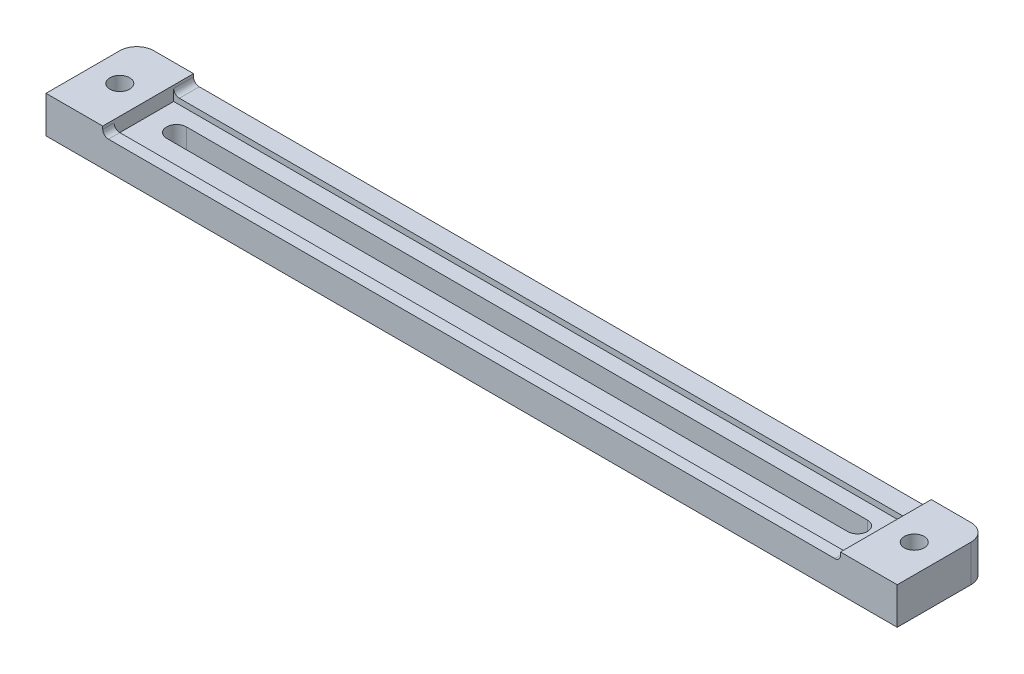
ISO-10303-21;
HEADER;
FILE_DESCRIPTION(('STEP AP214'),'2;1');
FILE_NAME('part.step','',(''),(''),'','','');
FILE_SCHEMA(('AUTOMOTIVE_DESIGN { 1 0 10303 214 1 1 1 1 }'));
ENDSEC;
DATA;
#1=APPLICATION_CONTEXT('core data for automotive mechanical design processes');
#2=APPLICATION_PROTOCOL_DEFINITION('international standard','automotive_design',2000,#1);
#3=PRODUCT_CONTEXT('',#1,'mechanical');
#4=PRODUCT('Part','Part','',(#3));
#5=PRODUCT_RELATED_PRODUCT_CATEGORY('part','',(#4));
#6=PRODUCT_DEFINITION_FORMATION('','',#4);
#7=PRODUCT_DEFINITION_CONTEXT('part definition',#1,'design');
#8=PRODUCT_DEFINITION('design','',#6,#7);
#9=PRODUCT_DEFINITION_SHAPE('','',#8);
#10=(LENGTH_UNIT() NAMED_UNIT(*) SI_UNIT(.MILLI.,.METRE.));
#11=(NAMED_UNIT(*) PLANE_ANGLE_UNIT() SI_UNIT($,.RADIAN.));
#12=(NAMED_UNIT(*) SI_UNIT($,.STERADIAN.) SOLID_ANGLE_UNIT());
#13=UNCERTAINTY_MEASURE_WITH_UNIT(LENGTH_MEASURE(1.E-05),#10,'distance_accuracy_value','');
#14=(GEOMETRIC_REPRESENTATION_CONTEXT(3) GLOBAL_UNCERTAINTY_ASSIGNED_CONTEXT((#13)) GLOBAL_UNIT_ASSIGNED_CONTEXT((#10,
#11,#12)) REPRESENTATION_CONTEXT('',''));
#15=CARTESIAN_POINT('',(0.,0.,0.));
#16=DIRECTION('',(0.,0.,1.));
#17=DIRECTION('',(1.,0.,0.));
#18=AXIS2_PLACEMENT_3D('',#15,#16,#17);
#19=CARTESIAN_POINT('',(0.,5.,0.));
#20=DIRECTION('',(0.,1.,0.));
#21=DIRECTION('',(0.,0.,1.));
#22=AXIS2_PLACEMENT_3D('',#19,#20,#21);
#23=PLANE('',#22);
#24=DIRECTION('',(1.,0.,0.));
#25=VECTOR('',#24,1.);
#26=CARTESIAN_POINT('',(0.,5.,-4.50000000000002));
#27=LINE('',#26,#25);
#28=CARTESIAN_POINT('',(-64.,5.,-4.50000000000002));
#29=VERTEX_POINT('',#28);
#30=CARTESIAN_POINT('',(64.,5.,-4.50000000000002));
#31=VERTEX_POINT('',#30);
#32=EDGE_CURVE('E251',#29,#31,#27,.T.);
#33=ORIENTED_EDGE('',*,*,#32,.T.);
#34=DIRECTION('',(0.,0.,1.));
#35=VECTOR('',#34,1.);
#36=CARTESIAN_POINT('',(64.,5.,-8.00000000000001));
#37=LINE('',#36,#35);
#38=CARTESIAN_POINT('',(64.,5.,-8.00000000000001));
#39=VERTEX_POINT('',#38);
#40=EDGE_CURVE('E345',#31,#39,#37,.F.);
#41=ORIENTED_EDGE('',*,*,#40,.T.);
#42=DIRECTION('',(-1.,0.,0.));
#43=VECTOR('',#42,1.);
#44=CARTESIAN_POINT('',(0.,5.,-8.00000000000001));
#45=LINE('',#44,#43);
#46=CARTESIAN_POINT('',(-64.,5.,-8.));
#47=VERTEX_POINT('',#46);
#48=EDGE_CURVE('E244',#39,#47,#45,.T.);
#49=ORIENTED_EDGE('',*,*,#48,.T.);
#50=DIRECTION('',(0.,0.,1.));
#51=VECTOR('',#50,1.);
#52=CARTESIAN_POINT('',(-64.,5.,0.));
#53=LINE('',#52,#51);
#54=EDGE_CURVE('E342',#47,#29,#53,.T.);
#55=ORIENTED_EDGE('',*,*,#54,.T.);
#56=EDGE_LOOP('',(#33,#41,#49,#55));
#57=FACE_BOUND('',#56,.T.);
#58=ADVANCED_FACE('F35',(#57),#23,.T.);
#59=DIRECTION('',(1.,0.,0.));
#60=VECTOR('',#59,1.);
#61=CARTESIAN_POINT('',(0.,5.,7.99999999999999));
#62=LINE('',#61,#60);
#63=CARTESIAN_POINT('',(-64.0000000000001,5.,8.));
#64=VERTEX_POINT('',#63);
#65=CARTESIAN_POINT('',(64.,5.,7.99999999999998));
#66=VERTEX_POINT('',#65);
#67=EDGE_CURVE('E247',#64,#66,#62,.T.);
#68=ORIENTED_EDGE('',*,*,#67,.T.);
#69=DIRECTION('',(0.,0.,1.));
#70=VECTOR('',#69,1.);
#71=CARTESIAN_POINT('',(64.,5.,5.99999999999998));
#72=LINE('',#71,#70);
#73=CARTESIAN_POINT('',(64.,5.,5.99999999999998));
#74=VERTEX_POINT('',#73);
#75=EDGE_CURVE('E349',#66,#74,#72,.F.);
#76=ORIENTED_EDGE('',*,*,#75,.T.);
#77=DIRECTION('',(1.,0.,0.));
#78=VECTOR('',#77,1.);
#79=CARTESIAN_POINT('',(0.,5.,5.99999999999998));
#80=LINE('',#79,#78);
#81=CARTESIAN_POINT('',(-64.0000000000001,5.,5.99999999999998));
#82=VERTEX_POINT('',#81);
#83=EDGE_CURVE('E254',#82,#74,#80,.T.);
#84=ORIENTED_EDGE('',*,*,#83,.F.);
#85=DIRECTION('',(0.,0.,-1.));
#86=VECTOR('',#85,1.);
#87=CARTESIAN_POINT('',(-64.,5.,0.));
#88=LINE('',#87,#86);
#89=EDGE_CURVE('E347',#82,#64,#88,.F.);
#90=ORIENTED_EDGE('',*,*,#89,.T.);
#91=EDGE_LOOP('',(#68,#76,#84,#90));
#92=FACE_BOUND('',#91,.T.);
#93=ADVANCED_FACE('F374',(#92),#23,.T.);
#94=CARTESIAN_POINT('',(0.,4.,-8.00000000000001));
#95=DIRECTION('',(0.,0.,1.));
#96=DIRECTION('',(1.,0.,0.));
#97=AXIS2_PLACEMENT_3D('',#94,#95,#96);
#98=PLANE('',#97);
#99=DIRECTION('',(-1.,0.,0.));
#100=VECTOR('',#99,1.);
#101=CARTESIAN_POINT('',(0.,0.,-8.00000000000001));
#102=LINE('',#101,#100);
#103=CARTESIAN_POINT('',(72.,0.,-8.00000000000002));
#104=VERTEX_POINT('',#103);
#105=CARTESIAN_POINT('',(-72.,0.,-7.99999999999999));
#106=VERTEX_POINT('',#105);
#107=EDGE_CURVE('E301',#104,#106,#102,.T.);
#108=ORIENTED_EDGE('',*,*,#107,.T.);
#109=DIRECTION('',(0.,-1.,0.));
#110=VECTOR('',#109,1.);
#111=CARTESIAN_POINT('',(-72.,4.,-7.99999999999999));
#112=LINE('',#111,#110);
#113=CARTESIAN_POINT('',(-72.,6.5,-8.));
#114=VERTEX_POINT('',#113);
#115=EDGE_CURVE('E211',#114,#106,#112,.T.);
#116=ORIENTED_EDGE('',*,*,#115,.F.);
#117=DIRECTION('',(-1.,0.,0.));
#118=VECTOR('',#117,1.);
#119=CARTESIAN_POINT('',(-65.0000000000001,6.5,-8.));
#120=LINE('',#119,#118);
#121=CARTESIAN_POINT('',(-65.0000000000001,6.5,-8.));
#122=VERTEX_POINT('',#121);
#123=EDGE_CURVE('E189',#122,#114,#120,.T.);
#124=ORIENTED_EDGE('',*,*,#123,.F.);
#125=DIRECTION('',(0.,-1.,0.));
#126=VECTOR('',#125,1.);
#127=CARTESIAN_POINT('',(-65.0000000000001,6.5,-8.));
#128=LINE('',#127,#126);
#129=CARTESIAN_POINT('',(-65.0000000000001,6.,-8.));
#130=VERTEX_POINT('',#129);
#131=EDGE_CURVE('E199',#122,#130,#128,.T.);
#132=ORIENTED_EDGE('',*,*,#131,.T.);
#133=CARTESIAN_POINT('',(-64.,6.,-8.));
#134=DIRECTION('',(0.,0.,1.));
#135=DIRECTION('',(1.,0.,0.));
#136=AXIS2_PLACEMENT_3D('',#133,#134,#135);
#137=CIRCLE('',#136,1.);
#138=EDGE_CURVE('E366',#130,#47,#137,.T.);
#139=ORIENTED_EDGE('',*,*,#138,.T.);
#140=ORIENTED_EDGE('',*,*,#48,.F.);
#141=CARTESIAN_POINT('',(64.,6.,-8.00000000000001));
#142=DIRECTION('',(0.,0.,1.));
#143=DIRECTION('',(1.,0.,0.));
#144=AXIS2_PLACEMENT_3D('',#141,#142,#143);
#145=CIRCLE('',#144,1.);
#146=CARTESIAN_POINT('',(65.,6.,-8.00000000000002));
#147=VERTEX_POINT('',#146);
#148=EDGE_CURVE('E357',#39,#147,#145,.T.);
#149=ORIENTED_EDGE('',*,*,#148,.T.);
#150=DIRECTION('',(0.,-1.,0.));
#151=VECTOR('',#150,1.);
#152=CARTESIAN_POINT('',(65.,6.5,-8.00000000000002));
#153=LINE('',#152,#151);
#154=CARTESIAN_POINT('',(65.,6.5,-8.00000000000002));
#155=VERTEX_POINT('',#154);
#156=EDGE_CURVE('E237',#155,#147,#153,.T.);
#157=ORIENTED_EDGE('',*,*,#156,.F.);
#158=DIRECTION('',(-1.,0.,0.));
#159=VECTOR('',#158,1.);
#160=CARTESIAN_POINT('',(72.,6.5,-8.00000000000002));
#161=LINE('',#160,#159);
#162=CARTESIAN_POINT('',(72.,6.5,-8.00000000000002));
#163=VERTEX_POINT('',#162);
#164=EDGE_CURVE('E234',#163,#155,#161,.T.);
#165=ORIENTED_EDGE('',*,*,#164,.F.);
#166=DIRECTION('',(0.,-1.,0.));
#167=VECTOR('',#166,1.);
#168=CARTESIAN_POINT('',(72.,4.,-8.00000000000002));
#169=LINE('',#168,#167);
#170=EDGE_CURVE('E317',#163,#104,#169,.T.);
#171=ORIENTED_EDGE('',*,*,#170,.T.);
#172=EDGE_LOOP('',(#108,#116,#124,#132,#139,#140,#149,#157,#165,#171));
#173=FACE_BOUND('',#172,.T.);
#174=ADVANCED_FACE('F209',(#173),#98,.F.);
#175=CARTESIAN_POINT('',(-72.,4.,-5.));
#176=DIRECTION('',(0.,-1.,0.));
#177=DIRECTION('',(0.,0.,-1.));
#178=AXIS2_PLACEMENT_3D('',#175,#176,#177);
#179=CYLINDRICAL_SURFACE('',#178,3.);
#180=CARTESIAN_POINT('',(-72.,0.,-5.));
#181=DIRECTION('',(0.,1.,0.));
#182=DIRECTION('',(0.,0.,1.));
#183=AXIS2_PLACEMENT_3D('',#180,#181,#182);
#184=CIRCLE('',#183,3.);
#185=CARTESIAN_POINT('',(-75.,0.,-4.99999999999997));
#186=VERTEX_POINT('',#185);
#187=EDGE_CURVE('E303',#106,#186,#184,.T.);
#188=ORIENTED_EDGE('',*,*,#187,.T.);
#189=DIRECTION('',(0.,-1.,0.));
#190=VECTOR('',#189,1.);
#191=CARTESIAN_POINT('',(-75.,4.,-4.99999999999997));
#192=LINE('',#191,#190);
#193=CARTESIAN_POINT('',(-75.,6.5,-4.99999999999997));
#194=VERTEX_POINT('',#193);
#195=EDGE_CURVE('E326',#194,#186,#192,.T.);
#196=ORIENTED_EDGE('',*,*,#195,.F.);
#197=CARTESIAN_POINT('',(-72.,6.5,-4.99999999999999));
#198=DIRECTION('',(0.,1.,0.));
#199=DIRECTION('',(0.,0.,1.));
#200=AXIS2_PLACEMENT_3D('',#197,#198,#199);
#201=CIRCLE('',#200,3.00000000000001);
#202=EDGE_CURVE('E212',#114,#194,#201,.T.);
#203=ORIENTED_EDGE('',*,*,#202,.F.);
#204=ORIENTED_EDGE('',*,*,#115,.T.);
#205=EDGE_LOOP('',(#188,#196,#203,#204));
#206=FACE_BOUND('',#205,.T.);
#207=ADVANCED_FACE('F420',(#206),#179,.T.);
#208=CARTESIAN_POINT('',(-75.,4.,0.));
#209=DIRECTION('',(-1.,0.,0.));
#210=DIRECTION('',(0.,0.,1.));
#211=AXIS2_PLACEMENT_3D('',#208,#209,#210);
#212=PLANE('',#211);
#213=DIRECTION('',(0.,0.,-1.));
#214=VECTOR('',#213,1.);
#215=CARTESIAN_POINT('',(-75.,0.,0.));
#216=LINE('',#215,#214);
#217=CARTESIAN_POINT('',(-75.,0.,8.00000000000001));
#218=VERTEX_POINT('',#217);
#219=EDGE_CURVE('E306',#218,#186,#216,.T.);
#220=ORIENTED_EDGE('',*,*,#219,.F.);
#221=DIRECTION('',(0.,-1.,0.));
#222=VECTOR('',#221,1.);
#223=CARTESIAN_POINT('',(-75.,4.,8.00000000000001));
#224=LINE('',#223,#222);
#225=CARTESIAN_POINT('',(-75.,6.5,8.00000000000001));
#226=VERTEX_POINT('',#225);
#227=EDGE_CURVE('E324',#226,#218,#224,.T.);
#228=ORIENTED_EDGE('',*,*,#227,.F.);
#229=DIRECTION('',(0.,0.,1.));
#230=VECTOR('',#229,1.);
#231=CARTESIAN_POINT('',(-75.,6.5,-4.99999999999997));
#232=LINE('',#231,#230);
#233=EDGE_CURVE('E214',#194,#226,#232,.T.);
#234=ORIENTED_EDGE('',*,*,#233,.F.);
#235=ORIENTED_EDGE('',*,*,#195,.T.);
#236=EDGE_LOOP('',(#220,#228,#234,#235));
#237=FACE_BOUND('',#236,.T.);
#238=ADVANCED_FACE('F423',(#237),#212,.T.);
#239=CARTESIAN_POINT('',(0.,4.,7.99999999999999));
#240=DIRECTION('',(0.,0.,1.));
#241=DIRECTION('',(1.,0.,0.));
#242=AXIS2_PLACEMENT_3D('',#239,#240,#241);
#243=PLANE('',#242);
#244=DIRECTION('',(-1.,0.,0.));
#245=VECTOR('',#244,1.);
#246=CARTESIAN_POINT('',(0.,0.,7.99999999999999));
#247=LINE('',#246,#245);
#248=CARTESIAN_POINT('',(75.,0.,7.99999999999998));
#249=VERTEX_POINT('',#248);
#250=EDGE_CURVE('E309',#249,#218,#247,.T.);
#251=ORIENTED_EDGE('',*,*,#250,.F.);
#252=DIRECTION('',(0.,-1.,0.));
#253=VECTOR('',#252,1.);
#254=CARTESIAN_POINT('',(75.,4.,7.99999999999998));
#255=LINE('',#254,#253);
#256=CARTESIAN_POINT('',(75.,6.5,7.99999999999998));
#257=VERTEX_POINT('',#256);
#258=EDGE_CURVE('E322',#257,#249,#255,.T.);
#259=ORIENTED_EDGE('',*,*,#258,.F.);
#260=DIRECTION('',(1.,0.,0.));
#261=VECTOR('',#260,1.);
#262=CARTESIAN_POINT('',(65.,6.5,7.99999999999998));
#263=LINE('',#262,#261);
#264=CARTESIAN_POINT('',(65.,6.5,7.99999999999998));
#265=VERTEX_POINT('',#264);
#266=EDGE_CURVE('E225',#265,#257,#263,.T.);
#267=ORIENTED_EDGE('',*,*,#266,.F.);
#268=DIRECTION('',(0.,-1.,0.));
#269=VECTOR('',#268,1.);
#270=CARTESIAN_POINT('',(65.,6.5,7.99999999999998));
#271=LINE('',#270,#269);
#272=CARTESIAN_POINT('',(65.,6.,7.99999999999998));
#273=VERTEX_POINT('',#272);
#274=EDGE_CURVE('E240',#265,#273,#271,.T.);
#275=ORIENTED_EDGE('',*,*,#274,.T.);
#276=CARTESIAN_POINT('',(64.,6.,7.99999999999998));
#277=DIRECTION('',(0.,0.,1.));
#278=DIRECTION('',(1.,0.,0.));
#279=AXIS2_PLACEMENT_3D('',#276,#277,#278);
#280=CIRCLE('',#279,1.);
#281=EDGE_CURVE('E359',#273,#66,#280,.F.);
#282=ORIENTED_EDGE('',*,*,#281,.T.);
#283=ORIENTED_EDGE('',*,*,#67,.F.);
#284=CARTESIAN_POINT('',(-64.0000000000001,6.,8.));
#285=DIRECTION('',(0.,0.,1.));
#286=DIRECTION('',(1.,0.,0.));
#287=AXIS2_PLACEMENT_3D('',#284,#285,#286);
#288=CIRCLE('',#287,1.);
#289=CARTESIAN_POINT('',(-65.,6.,8.));
#290=VERTEX_POINT('',#289);
#291=EDGE_CURVE('E11',#64,#290,#288,.F.);
#292=ORIENTED_EDGE('',*,*,#291,.T.);
#293=DIRECTION('',(0.,-1.,0.));
#294=VECTOR('',#293,1.);
#295=CARTESIAN_POINT('',(-65.,6.5,8.));
#296=LINE('',#295,#294);
#297=CARTESIAN_POINT('',(-65.,6.5,8.));
#298=VERTEX_POINT('',#297);
#299=EDGE_CURVE('E206',#298,#290,#296,.T.);
#300=ORIENTED_EDGE('',*,*,#299,.F.);
#301=DIRECTION('',(1.,0.,0.));
#302=VECTOR('',#301,1.);
#303=CARTESIAN_POINT('',(-75.,6.5,8.00000000000001));
#304=LINE('',#303,#302);
#305=EDGE_CURVE('E193',#226,#298,#304,.T.);
#306=ORIENTED_EDGE('',*,*,#305,.F.);
#307=ORIENTED_EDGE('',*,*,#227,.T.);
#308=EDGE_LOOP('',(#251,#259,#267,#275,#282,#283,#292,#300,#306,#307));
#309=FACE_BOUND('',#308,.T.);
#310=ADVANCED_FACE('F380',(#309),#243,.T.);
#311=CARTESIAN_POINT('',(75.,4.,0.));
#312=DIRECTION('',(-1.,0.,0.));
#313=DIRECTION('',(0.,0.,1.));
#314=AXIS2_PLACEMENT_3D('',#311,#312,#313);
#315=PLANE('',#314);
#316=DIRECTION('',(0.,0.,-1.));
#317=VECTOR('',#316,1.);
#318=CARTESIAN_POINT('',(75.,0.,0.));
#319=LINE('',#318,#317);
#320=CARTESIAN_POINT('',(75.,0.,-4.99999999999999));
#321=VERTEX_POINT('',#320);
#322=EDGE_CURVE('E312',#249,#321,#319,.T.);
#323=ORIENTED_EDGE('',*,*,#322,.T.);
#324=DIRECTION('',(0.,-1.,0.));
#325=VECTOR('',#324,1.);
#326=CARTESIAN_POINT('',(75.,4.,-4.99999999999999));
#327=LINE('',#326,#325);
#328=CARTESIAN_POINT('',(75.,6.5,-4.99999999999999));
#329=VERTEX_POINT('',#328);
#330=EDGE_CURVE('E319',#329,#321,#327,.T.);
#331=ORIENTED_EDGE('',*,*,#330,.F.);
#332=DIRECTION('',(0.,0.,-1.));
#333=VECTOR('',#332,1.);
#334=CARTESIAN_POINT('',(75.,6.5,7.99999999999998));
#335=LINE('',#334,#333);
#336=EDGE_CURVE('E228',#257,#329,#335,.T.);
#337=ORIENTED_EDGE('',*,*,#336,.F.);
#338=ORIENTED_EDGE('',*,*,#258,.T.);
#339=EDGE_LOOP('',(#323,#331,#337,#338));
#340=FACE_BOUND('',#339,.T.);
#341=ADVANCED_FACE('F426',(#340),#315,.F.);
#342=CARTESIAN_POINT('',(0.,4.,-1.75000000000001));
#343=DIRECTION('',(0.,0.,1.));
#344=DIRECTION('',(1.,0.,0.));
#345=AXIS2_PLACEMENT_3D('',#342,#343,#344);
#346=PLANE('',#345);
#347=DIRECTION('',(-1.,0.,0.));
#348=VECTOR('',#347,1.);
#349=CARTESIAN_POINT('',(0.,0.,-1.75000000000001));
#350=LINE('',#349,#348);
#351=CARTESIAN_POINT('',(60.,0.,-1.75000000000002));
#352=VERTEX_POINT('',#351);
#353=CARTESIAN_POINT('',(-60.,0.,-1.75));
#354=VERTEX_POINT('',#353);
#355=EDGE_CURVE('E272',#352,#354,#350,.T.);
#356=ORIENTED_EDGE('',*,*,#355,.F.);
#357=DIRECTION('',(0.,-1.,0.));
#358=VECTOR('',#357,1.);
#359=CARTESIAN_POINT('',(60.,4.,-1.75000000000002));
#360=LINE('',#359,#358);
#361=CARTESIAN_POINT('',(60.,4.,-1.75000000000002));
#362=VERTEX_POINT('',#361);
#363=EDGE_CURVE('E320',#362,#352,#360,.T.);
#364=ORIENTED_EDGE('',*,*,#363,.F.);
#365=DIRECTION('',(-1.,0.,0.));
#366=VECTOR('',#365,1.);
#367=CARTESIAN_POINT('',(0.,4.,-1.75000000000001));
#368=LINE('',#367,#366);
#369=CARTESIAN_POINT('',(-60.,4.,-1.75));
#370=VERTEX_POINT('',#369);
#371=EDGE_CURVE('E273',#362,#370,#368,.T.);
#372=ORIENTED_EDGE('',*,*,#371,.T.);
#373=DIRECTION('',(0.,-1.,0.));
#374=VECTOR('',#373,1.);
#375=CARTESIAN_POINT('',(-60.,4.,-1.75));
#376=LINE('',#375,#374);
#377=EDGE_CURVE('E284',#370,#354,#376,.T.);
#378=ORIENTED_EDGE('',*,*,#377,.T.);
#379=EDGE_LOOP('',(#356,#364,#372,#378));
#380=FACE_BOUND('',#379,.T.);
#381=ADVANCED_FACE('F428',(#380),#346,.T.);
#382=CARTESIAN_POINT('',(60.,4.,-2.11419423634673E-13));
#383=DIRECTION('',(0.,-1.,0.));
#384=DIRECTION('',(0.,0.,-1.));
#385=AXIS2_PLACEMENT_3D('',#382,#383,#384);
#386=CYLINDRICAL_SURFACE('',#385,1.75);
#387=CARTESIAN_POINT('',(60.,0.,-2.11419423634673E-13));
#388=DIRECTION('',(0.,1.,0.));
#389=DIRECTION('',(0.,0.,1.));
#390=AXIS2_PLACEMENT_3D('',#387,#388,#389);
#391=CIRCLE('',#390,1.75);
#392=CARTESIAN_POINT('',(60.,0.,1.74999999999998));
#393=VERTEX_POINT('',#392);
#394=EDGE_CURVE('E287',#352,#393,#391,.F.);
#395=ORIENTED_EDGE('',*,*,#394,.T.);
#396=DIRECTION('',(0.,-1.,0.));
#397=VECTOR('',#396,1.);
#398=CARTESIAN_POINT('',(60.,4.,1.74999999999998));
#399=LINE('',#398,#397);
#400=CARTESIAN_POINT('',(60.,4.,1.74999999999998));
#401=VERTEX_POINT('',#400);
#402=EDGE_CURVE('E333',#401,#393,#399,.T.);
#403=ORIENTED_EDGE('',*,*,#402,.F.);
#404=CARTESIAN_POINT('',(60.,4.,-2.11419423634673E-13));
#405=DIRECTION('',(0.,1.,0.));
#406=DIRECTION('',(0.,0.,1.));
#407=AXIS2_PLACEMENT_3D('',#404,#405,#406);
#408=CIRCLE('',#407,1.75);
#409=EDGE_CURVE('E276',#362,#401,#408,.F.);
#410=ORIENTED_EDGE('',*,*,#409,.F.);
#411=ORIENTED_EDGE('',*,*,#363,.T.);
#412=EDGE_LOOP('',(#395,#403,#410,#411));
#413=FACE_BOUND('',#412,.T.);
#414=ADVANCED_FACE('F434',(#413),#386,.F.);
#415=CARTESIAN_POINT('',(0.,4.,1.74999999999999));
#416=DIRECTION('',(0.,0.,1.));
#417=DIRECTION('',(1.,0.,0.));
#418=AXIS2_PLACEMENT_3D('',#415,#416,#417);
#419=PLANE('',#418);
#420=DIRECTION('',(-1.,0.,0.));
#421=VECTOR('',#420,1.);
#422=CARTESIAN_POINT('',(0.,0.,1.74999999999999));
#423=LINE('',#422,#421);
#424=CARTESIAN_POINT('',(-60.,0.,1.75));
#425=VERTEX_POINT('',#424);
#426=EDGE_CURVE('E289',#393,#425,#423,.T.);
#427=ORIENTED_EDGE('',*,*,#426,.T.);
#428=DIRECTION('',(0.,-1.,0.));
#429=VECTOR('',#428,1.);
#430=CARTESIAN_POINT('',(-60.,4.,1.75));
#431=LINE('',#430,#429);
#432=CARTESIAN_POINT('',(-60.,4.,1.75));
#433=VERTEX_POINT('',#432);
#434=EDGE_CURVE('E331',#433,#425,#431,.T.);
#435=ORIENTED_EDGE('',*,*,#434,.F.);
#436=DIRECTION('',(-1.,0.,0.));
#437=VECTOR('',#436,1.);
#438=CARTESIAN_POINT('',(0.,4.,1.74999999999999));
#439=LINE('',#438,#437);
#440=EDGE_CURVE('E279',#401,#433,#439,.T.);
#441=ORIENTED_EDGE('',*,*,#440,.F.);
#442=ORIENTED_EDGE('',*,*,#402,.T.);
#443=EDGE_LOOP('',(#427,#435,#441,#442));
#444=FACE_BOUND('',#443,.T.);
#445=ADVANCED_FACE('F476',(#444),#419,.F.);
#446=CARTESIAN_POINT('',(-70.,4.,0.));
#447=DIRECTION('',(0.,-1.,0.));
#448=DIRECTION('',(0.,0.,-1.));
#449=AXIS2_PLACEMENT_3D('',#446,#447,#448);
#450=CYLINDRICAL_SURFACE('',#449,1.75);
#451=CARTESIAN_POINT('',(-70.,0.,0.));
#452=DIRECTION('',(0.,1.,0.));
#453=DIRECTION('',(0.,0.,1.));
#454=AXIS2_PLACEMENT_3D('',#451,#452,#453);
#455=CIRCLE('',#454,1.75);
#456=CARTESIAN_POINT('',(-70.,0.,1.75));
#457=VERTEX_POINT('',#456);
#458=EDGE_CURVE('E298',#457,#457,#455,.T.);
#459=ORIENTED_EDGE('',*,*,#458,.F.);
#460=EDGE_LOOP('',(#459));
#461=FACE_BOUND('',#460,.T.);
#462=CARTESIAN_POINT('',(-70.,6.5,0.));
#463=DIRECTION('',(0.,1.,0.));
#464=DIRECTION('',(0.,0.,1.));
#465=AXIS2_PLACEMENT_3D('',#462,#463,#464);
#466=CIRCLE('',#465,1.75);
#467=CARTESIAN_POINT('',(-70.,6.5,1.75));
#468=VERTEX_POINT('',#467);
#469=EDGE_CURVE('E196',#468,#468,#466,.T.);
#470=ORIENTED_EDGE('',*,*,#469,.T.);
#471=EDGE_LOOP('',(#470));
#472=FACE_BOUND('',#471,.T.);
#473=ADVANCED_FACE('F470',(#461,#472),#450,.F.);
#474=CARTESIAN_POINT('',(70.,4.,-2.42861286636753E-13));
#475=DIRECTION('',(0.,-1.,0.));
#476=DIRECTION('',(0.,0.,-1.));
#477=AXIS2_PLACEMENT_3D('',#474,#475,#476);
#478=CYLINDRICAL_SURFACE('',#477,1.75);
#479=CARTESIAN_POINT('',(70.,0.,-2.42861286636753E-13));
#480=DIRECTION('',(0.,1.,0.));
#481=DIRECTION('',(0.,0.,1.));
#482=AXIS2_PLACEMENT_3D('',#479,#480,#481);
#483=CIRCLE('',#482,1.75);
#484=CARTESIAN_POINT('',(70.,0.,1.74999999999975));
#485=VERTEX_POINT('',#484);
#486=EDGE_CURVE('E295',#485,#485,#483,.F.);
#487=ORIENTED_EDGE('',*,*,#486,.T.);
#488=EDGE_LOOP('',(#487));
#489=FACE_BOUND('',#488,.T.);
#490=CARTESIAN_POINT('',(70.,6.5,-2.42861286636753E-13));
#491=DIRECTION('',(0.,1.,0.));
#492=DIRECTION('',(0.,0.,1.));
#493=AXIS2_PLACEMENT_3D('',#490,#491,#492);
#494=CIRCLE('',#493,1.75);
#495=CARTESIAN_POINT('',(70.,6.5,1.74999999999975));
#496=VERTEX_POINT('',#495);
#497=EDGE_CURVE('E205',#496,#496,#494,.T.);
#498=ORIENTED_EDGE('',*,*,#497,.T.);
#499=EDGE_LOOP('',(#498));
#500=FACE_BOUND('',#499,.T.);
#501=ADVANCED_FACE('F464',(#489,#500),#478,.F.);
#502=CARTESIAN_POINT('',(-60.,4.,0.));
#503=DIRECTION('',(0.,-1.,0.));
#504=DIRECTION('',(0.,0.,-1.));
#505=AXIS2_PLACEMENT_3D('',#502,#503,#504);
#506=CYLINDRICAL_SURFACE('',#505,1.75);
#507=CARTESIAN_POINT('',(-60.,0.,0.));
#508=DIRECTION('',(0.,1.,0.));
#509=DIRECTION('',(0.,0.,1.));
#510=AXIS2_PLACEMENT_3D('',#507,#508,#509);
#511=CIRCLE('',#510,1.75);
#512=EDGE_CURVE('E292',#354,#425,#511,.T.);
#513=ORIENTED_EDGE('',*,*,#512,.F.);
#514=ORIENTED_EDGE('',*,*,#377,.F.);
#515=CARTESIAN_POINT('',(-60.,4.,0.));
#516=DIRECTION('',(0.,1.,0.));
#517=DIRECTION('',(0.,0.,1.));
#518=AXIS2_PLACEMENT_3D('',#515,#516,#517);
#519=CIRCLE('',#518,1.75);
#520=EDGE_CURVE('E281',#370,#433,#519,.T.);
#521=ORIENTED_EDGE('',*,*,#520,.T.);
#522=ORIENTED_EDGE('',*,*,#434,.T.);
#523=EDGE_LOOP('',(#513,#514,#521,#522));
#524=FACE_BOUND('',#523,.T.);
#525=ADVANCED_FACE('F460',(#524),#506,.F.);
#526=CARTESIAN_POINT('',(72.,4.,-5.00000000000002));
#527=DIRECTION('',(0.,-1.,0.));
#528=DIRECTION('',(0.,0.,-1.));
#529=AXIS2_PLACEMENT_3D('',#526,#527,#528);
#530=CYLINDRICAL_SURFACE('',#529,3.);
#531=CARTESIAN_POINT('',(72.,0.,-5.00000000000002));
#532=DIRECTION('',(0.,1.,0.));
#533=DIRECTION('',(0.,0.,1.));
#534=AXIS2_PLACEMENT_3D('',#531,#532,#533);
#535=CIRCLE('',#534,3.);
#536=EDGE_CURVE('E277',#104,#321,#535,.F.);
#537=ORIENTED_EDGE('',*,*,#536,.F.);
#538=ORIENTED_EDGE('',*,*,#170,.F.);
#539=CARTESIAN_POINT('',(71.9999999999999,6.5,-4.99999999999999));
#540=DIRECTION('',(0.,1.,0.));
#541=DIRECTION('',(0.,0.,1.));
#542=AXIS2_PLACEMENT_3D('',#539,#540,#541);
#543=CIRCLE('',#542,3.00000000000003);
#544=EDGE_CURVE('E231',#329,#163,#543,.T.);
#545=ORIENTED_EDGE('',*,*,#544,.F.);
#546=ORIENTED_EDGE('',*,*,#330,.T.);
#547=EDGE_LOOP('',(#537,#538,#545,#546));
#548=FACE_BOUND('',#547,.T.);
#549=ADVANCED_FACE('F414',(#548),#530,.T.);
#550=CARTESIAN_POINT('',(0.,4.,0.));
#551=DIRECTION('',(0.,1.,0.));
#552=DIRECTION('',(0.,0.,1.));
#553=AXIS2_PLACEMENT_3D('',#550,#551,#552);
#554=PLANE('',#553);
#555=DIRECTION('',(1.,0.,0.));
#556=VECTOR('',#555,1.);
#557=CARTESIAN_POINT('',(0.,4.,-4.50000000000002));
#558=LINE('',#557,#556);
#559=CARTESIAN_POINT('',(-65.,4.,-4.50000000000002));
#560=VERTEX_POINT('',#559);
#561=CARTESIAN_POINT('',(65.,4.,-4.50000000000002));
#562=VERTEX_POINT('',#561);
#563=EDGE_CURVE('E243',#560,#562,#558,.T.);
#564=ORIENTED_EDGE('',*,*,#563,.F.);
#565=DIRECTION('',(0.,0.,-1.));
#566=VECTOR('',#565,1.);
#567=CARTESIAN_POINT('',(-65.,4.,0.));
#568=LINE('',#567,#566);
#569=CARTESIAN_POINT('',(-65.,4.,5.99999999999998));
#570=VERTEX_POINT('',#569);
#571=EDGE_CURVE('E248',#570,#560,#568,.T.);
#572=ORIENTED_EDGE('',*,*,#571,.F.);
#573=DIRECTION('',(1.,0.,0.));
#574=VECTOR('',#573,1.);
#575=CARTESIAN_POINT('',(0.,4.,5.99999999999998));
#576=LINE('',#575,#574);
#577=CARTESIAN_POINT('',(65.,4.,5.99999999999998));
#578=VERTEX_POINT('',#577);
#579=EDGE_CURVE('E261',#570,#578,#576,.T.);
#580=ORIENTED_EDGE('',*,*,#579,.T.);
#581=DIRECTION('',(0.,0.,-1.));
#582=VECTOR('',#581,1.);
#583=CARTESIAN_POINT('',(65.,4.,0.));
#584=LINE('',#583,#582);
#585=EDGE_CURVE('E258',#578,#562,#584,.T.);
#586=ORIENTED_EDGE('',*,*,#585,.T.);
#587=EDGE_LOOP('',(#564,#572,#580,#586));
#588=FACE_BOUND('',#587,.T.);
#589=ORIENTED_EDGE('',*,*,#371,.F.);
#590=ORIENTED_EDGE('',*,*,#409,.T.);
#591=ORIENTED_EDGE('',*,*,#440,.T.);
#592=ORIENTED_EDGE('',*,*,#520,.F.);
#593=EDGE_LOOP('',(#589,#590,#591,#592));
#594=FACE_BOUND('',#593,.T.);
#595=ADVANCED_FACE('F385',(#588,#594),#554,.T.);
#596=CARTESIAN_POINT('',(0.,0.,0.));
#597=DIRECTION('',(0.,1.,0.));
#598=DIRECTION('',(0.,0.,1.));
#599=AXIS2_PLACEMENT_3D('',#596,#597,#598);
#600=PLANE('',#599);
#601=ORIENTED_EDGE('',*,*,#355,.T.);
#602=ORIENTED_EDGE('',*,*,#512,.T.);
#603=ORIENTED_EDGE('',*,*,#426,.F.);
#604=ORIENTED_EDGE('',*,*,#394,.F.);
#605=EDGE_LOOP('',(#601,#602,#603,#604));
#606=FACE_BOUND('',#605,.T.);
#607=ORIENTED_EDGE('',*,*,#486,.F.);
#608=EDGE_LOOP('',(#607));
#609=FACE_BOUND('',#608,.T.);
#610=ORIENTED_EDGE('',*,*,#458,.T.);
#611=EDGE_LOOP('',(#610));
#612=FACE_BOUND('',#611,.T.);
#613=ORIENTED_EDGE('',*,*,#107,.F.);
#614=ORIENTED_EDGE('',*,*,#536,.T.);
#615=ORIENTED_EDGE('',*,*,#322,.F.);
#616=ORIENTED_EDGE('',*,*,#250,.T.);
#617=ORIENTED_EDGE('',*,*,#219,.T.);
#618=ORIENTED_EDGE('',*,*,#187,.F.);
#619=EDGE_LOOP('',(#613,#614,#615,#616,#617,#618));
#620=FACE_BOUND('',#619,.T.);
#621=ADVANCED_FACE('F417',(#606,#609,#612,#620),#600,.F.);
#622=CARTESIAN_POINT('',(0.,5.,-4.50000000000002));
#623=DIRECTION('',(0.,0.,-1.));
#624=DIRECTION('',(-1.,0.,0.));
#625=AXIS2_PLACEMENT_3D('',#622,#623,#624);
#626=PLANE('',#625);
#627=ORIENTED_EDGE('',*,*,#563,.T.);
#628=DIRECTION('',(0.,-1.,0.));
#629=VECTOR('',#628,1.);
#630=CARTESIAN_POINT('',(65.,5.,-4.50000000000002));
#631=LINE('',#630,#629);
#632=CARTESIAN_POINT('',(65.,6.,-4.50000000000002));
#633=VERTEX_POINT('',#632);
#634=EDGE_CURVE('E269',#633,#562,#631,.T.);
#635=ORIENTED_EDGE('',*,*,#634,.F.);
#636=CARTESIAN_POINT('',(64.,6.,-4.50000000000002));
#637=DIRECTION('',(0.,0.,-1.));
#638=DIRECTION('',(-1.,0.,0.));
#639=AXIS2_PLACEMENT_3D('',#636,#637,#638);
#640=CIRCLE('',#639,1.);
#641=EDGE_CURVE('E355',#633,#31,#640,.T.);
#642=ORIENTED_EDGE('',*,*,#641,.T.);
#643=ORIENTED_EDGE('',*,*,#32,.F.);
#644=CARTESIAN_POINT('',(-64.,6.,-4.50000000000002));
#645=DIRECTION('',(0.,0.,-1.));
#646=DIRECTION('',(-1.,0.,0.));
#647=AXIS2_PLACEMENT_3D('',#644,#645,#646);
#648=CIRCLE('',#647,1.);
#649=CARTESIAN_POINT('',(-65.,6.,-4.50000000000002));
#650=VERTEX_POINT('',#649);
#651=EDGE_CURVE('E364',#29,#650,#648,.T.);
#652=ORIENTED_EDGE('',*,*,#651,.T.);
#653=DIRECTION('',(0.,-1.,0.));
#654=VECTOR('',#653,1.);
#655=CARTESIAN_POINT('',(-65.,5.,-4.50000000000002));
#656=LINE('',#655,#654);
#657=EDGE_CURVE('E50',#650,#560,#656,.T.);
#658=ORIENTED_EDGE('',*,*,#657,.T.);
#659=EDGE_LOOP('',(#627,#635,#642,#643,#652,#658));
#660=FACE_BOUND('',#659,.T.);
#661=ADVANCED_FACE('F388',(#660),#626,.F.);
#662=CARTESIAN_POINT('',(65.,5.,0.));
#663=DIRECTION('',(-1.,0.,0.));
#664=DIRECTION('',(0.,0.,1.));
#665=AXIS2_PLACEMENT_3D('',#662,#663,#664);
#666=PLANE('',#665);
#667=ORIENTED_EDGE('',*,*,#156,.T.);
#668=DIRECTION('',(0.,0.,1.));
#669=VECTOR('',#668,1.);
#670=CARTESIAN_POINT('',(65.,6.,-4.50000000000002));
#671=LINE('',#670,#669);
#672=EDGE_CURVE('E339',#147,#633,#671,.T.);
#673=ORIENTED_EDGE('',*,*,#672,.T.);
#674=ORIENTED_EDGE('',*,*,#634,.T.);
#675=ORIENTED_EDGE('',*,*,#585,.F.);
#676=DIRECTION('',(0.,-1.,0.));
#677=VECTOR('',#676,1.);
#678=CARTESIAN_POINT('',(65.,5.,5.99999999999998));
#679=LINE('',#678,#677);
#680=CARTESIAN_POINT('',(65.,6.,5.99999999999998));
#681=VERTEX_POINT('',#680);
#682=EDGE_CURVE('E267',#681,#578,#679,.T.);
#683=ORIENTED_EDGE('',*,*,#682,.F.);
#684=DIRECTION('',(0.,0.,1.));
#685=VECTOR('',#684,1.);
#686=CARTESIAN_POINT('',(65.,6.,7.99999999999998));
#687=LINE('',#686,#685);
#688=EDGE_CURVE('E329',#681,#273,#687,.T.);
#689=ORIENTED_EDGE('',*,*,#688,.T.);
#690=ORIENTED_EDGE('',*,*,#274,.F.);
#691=DIRECTION('',(0.,0.,1.));
#692=VECTOR('',#691,1.);
#693=CARTESIAN_POINT('',(65.,6.5,-4.50000000000002));
#694=LINE('',#693,#692);
#695=EDGE_CURVE('E223',#155,#265,#694,.T.);
#696=ORIENTED_EDGE('',*,*,#695,.F.);
#697=EDGE_LOOP('',(#667,#673,#674,#675,#683,#689,#690,#696));
#698=FACE_BOUND('',#697,.T.);
#699=ADVANCED_FACE('F391',(#698),#666,.T.);
#700=CARTESIAN_POINT('',(0.,5.,5.99999999999998));
#701=DIRECTION('',(0.,0.,-1.));
#702=DIRECTION('',(-1.,0.,0.));
#703=AXIS2_PLACEMENT_3D('',#700,#701,#702);
#704=PLANE('',#703);
#705=ORIENTED_EDGE('',*,*,#579,.F.);
#706=DIRECTION('',(0.,-1.,0.));
#707=VECTOR('',#706,1.);
#708=CARTESIAN_POINT('',(-65.,5.,5.99999999999998));
#709=LINE('',#708,#707);
#710=CARTESIAN_POINT('',(-65.,6.,5.99999999999998));
#711=VERTEX_POINT('',#710);
#712=EDGE_CURVE('E58',#711,#570,#709,.T.);
#713=ORIENTED_EDGE('',*,*,#712,.F.);
#714=CARTESIAN_POINT('',(-64.,6.,5.99999999999998));
#715=DIRECTION('',(0.,0.,-1.));
#716=DIRECTION('',(-1.,0.,0.));
#717=AXIS2_PLACEMENT_3D('',#714,#715,#716);
#718=CIRCLE('',#717,1.);
#719=EDGE_CURVE('E43',#711,#82,#718,.F.);
#720=ORIENTED_EDGE('',*,*,#719,.T.);
#721=ORIENTED_EDGE('',*,*,#83,.T.);
#722=CARTESIAN_POINT('',(64.,6.,5.99999999999998));
#723=DIRECTION('',(0.,0.,-1.));
#724=DIRECTION('',(-1.,0.,0.));
#725=AXIS2_PLACEMENT_3D('',#722,#723,#724);
#726=CIRCLE('',#725,1.);
#727=EDGE_CURVE('E361',#74,#681,#726,.F.);
#728=ORIENTED_EDGE('',*,*,#727,.T.);
#729=ORIENTED_EDGE('',*,*,#682,.T.);
#730=EDGE_LOOP('',(#705,#713,#720,#721,#728,#729));
#731=FACE_BOUND('',#730,.T.);
#732=ADVANCED_FACE('F368',(#731),#704,.T.);
#733=CARTESIAN_POINT('',(-65.,5.,0.));
#734=DIRECTION('',(-1.,0.,0.));
#735=DIRECTION('',(0.,0.,1.));
#736=AXIS2_PLACEMENT_3D('',#733,#734,#735);
#737=PLANE('',#736);
#738=ORIENTED_EDGE('',*,*,#657,.F.);
#739=DIRECTION('',(0.,0.,1.));
#740=VECTOR('',#739,1.);
#741=CARTESIAN_POINT('',(-65.,6.,0.));
#742=LINE('',#741,#740);
#743=EDGE_CURVE('E202',#650,#130,#742,.F.);
#744=ORIENTED_EDGE('',*,*,#743,.T.);
#745=ORIENTED_EDGE('',*,*,#131,.F.);
#746=DIRECTION('',(0.,0.,-1.));
#747=VECTOR('',#746,1.);
#748=CARTESIAN_POINT('',(-65.,6.5,5.99999999999998));
#749=LINE('',#748,#747);
#750=EDGE_CURVE('E183',#298,#122,#749,.T.);
#751=ORIENTED_EDGE('',*,*,#750,.F.);
#752=ORIENTED_EDGE('',*,*,#299,.T.);
#753=DIRECTION('',(0.,0.,-1.));
#754=VECTOR('',#753,1.);
#755=CARTESIAN_POINT('',(-65.,6.,0.));
#756=LINE('',#755,#754);
#757=EDGE_CURVE('E351',#290,#711,#756,.T.);
#758=ORIENTED_EDGE('',*,*,#757,.T.);
#759=ORIENTED_EDGE('',*,*,#712,.T.);
#760=ORIENTED_EDGE('',*,*,#571,.T.);
#761=EDGE_LOOP('',(#738,#744,#745,#751,#752,#758,#759,#760));
#762=FACE_BOUND('',#761,.T.);
#763=ADVANCED_FACE('F200',(#762),#737,.F.);
#764=CARTESIAN_POINT('',(71.9999999999999,6.5,-4.99999999999999));
#765=DIRECTION('',(0.,1.,0.));
#766=DIRECTION('',(0.,0.,1.));
#767=AXIS2_PLACEMENT_3D('',#764,#765,#766);
#768=PLANE('',#767);
#769=ORIENTED_EDGE('',*,*,#695,.T.);
#770=ORIENTED_EDGE('',*,*,#266,.T.);
#771=ORIENTED_EDGE('',*,*,#336,.T.);
#772=ORIENTED_EDGE('',*,*,#544,.T.);
#773=ORIENTED_EDGE('',*,*,#164,.T.);
#774=EDGE_LOOP('',(#769,#770,#771,#772,#773));
#775=FACE_BOUND('',#774,.T.);
#776=ORIENTED_EDGE('',*,*,#497,.F.);
#777=EDGE_LOOP('',(#776));
#778=FACE_BOUND('',#777,.T.);
#779=ADVANCED_FACE('F407',(#775,#778),#768,.T.);
#780=CARTESIAN_POINT('',(-72.,6.5,-4.99999999999999));
#781=DIRECTION('',(0.,1.,0.));
#782=DIRECTION('',(0.,0.,1.));
#783=AXIS2_PLACEMENT_3D('',#780,#781,#782);
#784=PLANE('',#783);
#785=ORIENTED_EDGE('',*,*,#750,.T.);
#786=ORIENTED_EDGE('',*,*,#123,.T.);
#787=ORIENTED_EDGE('',*,*,#202,.T.);
#788=ORIENTED_EDGE('',*,*,#233,.T.);
#789=ORIENTED_EDGE('',*,*,#305,.T.);
#790=EDGE_LOOP('',(#785,#786,#787,#788,#789));
#791=FACE_BOUND('',#790,.T.);
#792=ORIENTED_EDGE('',*,*,#469,.F.);
#793=EDGE_LOOP('',(#792));
#794=FACE_BOUND('',#793,.T.);
#795=ADVANCED_FACE('F185',(#791,#794),#784,.T.);
#796=CARTESIAN_POINT('',(64.,6.,0.));
#797=DIRECTION('',(0.,0.,-1.));
#798=DIRECTION('',(-1.,0.,0.));
#799=AXIS2_PLACEMENT_3D('',#796,#797,#798);
#800=CYLINDRICAL_SURFACE('',#799,1.);
#801=ORIENTED_EDGE('',*,*,#148,.F.);
#802=ORIENTED_EDGE('',*,*,#40,.F.);
#803=ORIENTED_EDGE('',*,*,#641,.F.);
#804=ORIENTED_EDGE('',*,*,#672,.F.);
#805=EDGE_LOOP('',(#801,#802,#803,#804));
#806=FACE_BOUND('',#805,.T.);
#807=ADVANCED_FACE('F396',(#806),#800,.F.);
#808=CARTESIAN_POINT('',(64.,6.,0.));
#809=DIRECTION('',(0.,0.,-1.));
#810=DIRECTION('',(-1.,0.,0.));
#811=AXIS2_PLACEMENT_3D('',#808,#809,#810);
#812=CYLINDRICAL_SURFACE('',#811,1.);
#813=ORIENTED_EDGE('',*,*,#727,.F.);
#814=ORIENTED_EDGE('',*,*,#75,.F.);
#815=ORIENTED_EDGE('',*,*,#281,.F.);
#816=ORIENTED_EDGE('',*,*,#688,.F.);
#817=EDGE_LOOP('',(#813,#814,#815,#816));
#818=FACE_BOUND('',#817,.T.);
#819=ADVANCED_FACE('F485',(#818),#812,.F.);
#820=CARTESIAN_POINT('',(-64.,6.,0.));
#821=DIRECTION('',(0.,0.,1.));
#822=DIRECTION('',(1.,0.,0.));
#823=AXIS2_PLACEMENT_3D('',#820,#821,#822);
#824=CYLINDRICAL_SURFACE('',#823,1.);
#825=ORIENTED_EDGE('',*,*,#138,.F.);
#826=ORIENTED_EDGE('',*,*,#743,.F.);
#827=ORIENTED_EDGE('',*,*,#651,.F.);
#828=ORIENTED_EDGE('',*,*,#54,.F.);
#829=EDGE_LOOP('',(#825,#826,#827,#828));
#830=FACE_BOUND('',#829,.T.);
#831=ADVANCED_FACE('F403',(#830),#824,.F.);
#832=CARTESIAN_POINT('',(-64.,6.,0.));
#833=DIRECTION('',(0.,0.,-1.));
#834=DIRECTION('',(-1.,0.,0.));
#835=AXIS2_PLACEMENT_3D('',#832,#833,#834);
#836=CYLINDRICAL_SURFACE('',#835,1.);
#837=ORIENTED_EDGE('',*,*,#291,.F.);
#838=ORIENTED_EDGE('',*,*,#89,.F.);
#839=ORIENTED_EDGE('',*,*,#719,.F.);
#840=ORIENTED_EDGE('',*,*,#757,.F.);
#841=EDGE_LOOP('',(#837,#838,#839,#840));
#842=FACE_BOUND('',#841,.T.);
#843=ADVANCED_FACE('F37',(#842),#836,.F.);
#844=CLOSED_SHELL('',(#58,#93,#174,#207,#238,#310,#341,#381,#414,#445,#473,#501,#525,#549,#595,
#621,#661,#699,#732,#763,#779,#795,#807,#819,#831,#843));
#845=MANIFOLD_SOLID_BREP('B2',#844);
#846=ADVANCED_BREP_SHAPE_REPRESENTATION('',(#18,#845),#14);
#847=SHAPE_DEFINITION_REPRESENTATION(#9,#846);
ENDSEC;
END-ISO-10303-21;
